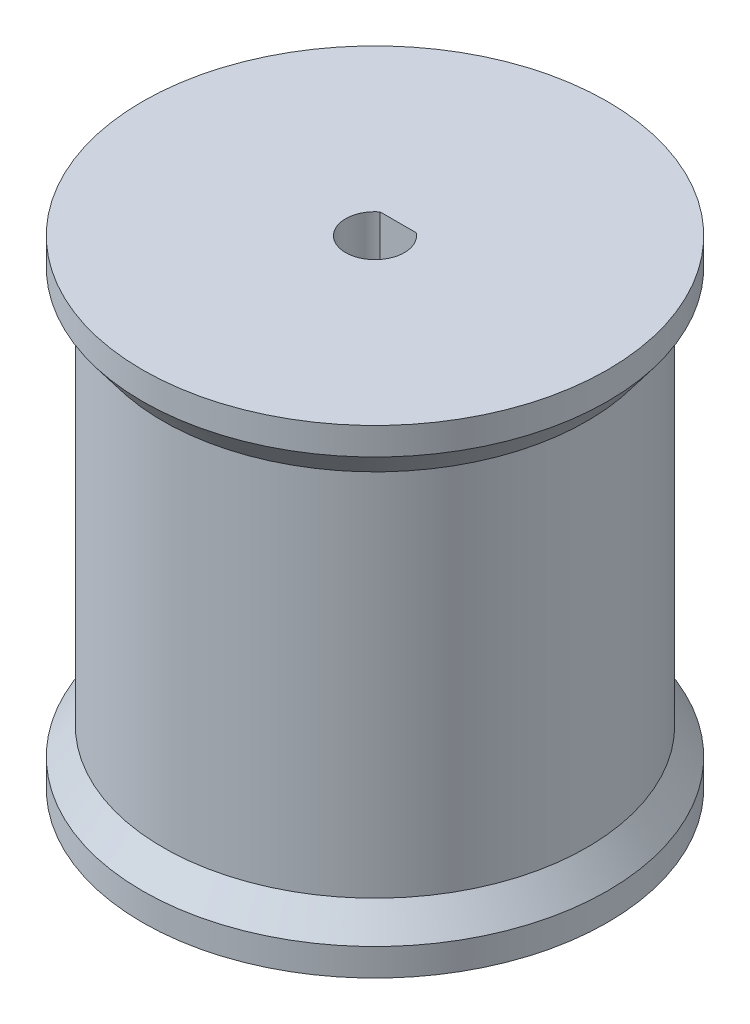
ISO-10303-21;
HEADER;
FILE_DESCRIPTION(('STEP AP214'),'2;1');
FILE_NAME('part.step','',(''),(''),'','','');
FILE_SCHEMA(('AUTOMOTIVE_DESIGN { 1 0 10303 214 1 1 1 1 }'));
ENDSEC;
DATA;
#1=APPLICATION_CONTEXT('core data for automotive mechanical design processes');
#2=APPLICATION_PROTOCOL_DEFINITION('international standard','automotive_design',2000,#1);
#3=PRODUCT_CONTEXT('',#1,'mechanical');
#4=PRODUCT('Part','Part','',(#3));
#5=PRODUCT_RELATED_PRODUCT_CATEGORY('part','',(#4));
#6=PRODUCT_DEFINITION_FORMATION('','',#4);
#7=PRODUCT_DEFINITION_CONTEXT('part definition',#1,'design');
#8=PRODUCT_DEFINITION('design','',#6,#7);
#9=PRODUCT_DEFINITION_SHAPE('','',#8);
#10=(LENGTH_UNIT() NAMED_UNIT(*) SI_UNIT(.MILLI.,.METRE.));
#11=(NAMED_UNIT(*) PLANE_ANGLE_UNIT() SI_UNIT($,.RADIAN.));
#12=(NAMED_UNIT(*) SI_UNIT($,.STERADIAN.) SOLID_ANGLE_UNIT());
#13=UNCERTAINTY_MEASURE_WITH_UNIT(LENGTH_MEASURE(1.E-05),#10,'distance_accuracy_value','');
#14=(GEOMETRIC_REPRESENTATION_CONTEXT(3) GLOBAL_UNCERTAINTY_ASSIGNED_CONTEXT((#13)) GLOBAL_UNIT_ASSIGNED_CONTEXT((#10,
#11,#12)) REPRESENTATION_CONTEXT('',''));
#15=CARTESIAN_POINT('',(0.,0.,0.));
#16=DIRECTION('',(0.,0.,1.));
#17=DIRECTION('',(1.,0.,0.));
#18=AXIS2_PLACEMENT_3D('',#15,#16,#17);
#19=CARTESIAN_POINT('',(-17.,0.,0.));
#20=DIRECTION('',(0.,1.,0.));
#21=DIRECTION('',(0.,0.,1.));
#22=AXIS2_PLACEMENT_3D('',#19,#20,#21);
#23=PLANE('',#22);
#24=CARTESIAN_POINT('',(0.,0.,0.));
#25=DIRECTION('',(0.,-1.,0.));
#26=DIRECTION('',(0.,0.,-1.));
#27=AXIS2_PLACEMENT_3D('',#24,#25,#26);
#28=CIRCLE('',#27,17.);
#29=CARTESIAN_POINT('',(0.,0.,-17.));
#30=VERTEX_POINT('',#29);
#31=EDGE_CURVE('E71',#30,#30,#28,.T.);
#32=ORIENTED_EDGE('',*,*,#31,.T.);
#33=EDGE_LOOP('',(#32));
#34=FACE_BOUND('',#33,.T.);
#35=ADVANCED_FACE('F39',(#34),#23,.F.);
#36=CARTESIAN_POINT('',(0.,35.,0.));
#37=DIRECTION('',(0.,-1.,0.));
#38=DIRECTION('',(0.,0.,-1.));
#39=AXIS2_PLACEMENT_3D('',#36,#37,#38);
#40=PLANE('',#39);
#41=DIRECTION('',(-1.,0.,0.));
#42=VECTOR('',#41,1.);
#43=CARTESIAN_POINT('',(-1.325,35.,-1.6931848688197));
#44=LINE('',#43,#42);
#45=CARTESIAN_POINT('',(1.325,35.,-1.6931848688197));
#46=VERTEX_POINT('',#45);
#47=CARTESIAN_POINT('',(-1.325,35.,-1.6931848688197));
#48=VERTEX_POINT('',#47);
#49=EDGE_CURVE('E75',#46,#48,#44,.T.);
#50=ORIENTED_EDGE('',*,*,#49,.F.);
#51=CARTESIAN_POINT('',(0.,35.,0.));
#52=DIRECTION('',(0.,1.,0.));
#53=DIRECTION('',(0.,0.,1.));
#54=AXIS2_PLACEMENT_3D('',#51,#52,#53);
#55=CIRCLE('',#54,2.15);
#56=EDGE_CURVE('E54',#48,#46,#55,.T.);
#57=ORIENTED_EDGE('',*,*,#56,.F.);
#58=EDGE_LOOP('',(#50,#57));
#59=FACE_BOUND('',#58,.T.);
#60=CARTESIAN_POINT('',(0.,35.,0.));
#61=DIRECTION('',(0.,-1.,0.));
#62=DIRECTION('',(0.,0.,-1.));
#63=AXIS2_PLACEMENT_3D('',#60,#61,#62);
#64=CIRCLE('',#63,17.);
#65=CARTESIAN_POINT('',(0.,35.,-17.));
#66=VERTEX_POINT('',#65);
#67=EDGE_CURVE('E11',#66,#66,#64,.T.);
#68=ORIENTED_EDGE('',*,*,#67,.F.);
#69=EDGE_LOOP('',(#68));
#70=FACE_BOUND('',#69,.T.);
#71=ADVANCED_FACE('F80',(#59,#70),#40,.F.);
#72=CARTESIAN_POINT('',(0.,0.,0.));
#73=DIRECTION('',(0.,-1.,0.));
#74=DIRECTION('',(0.,0.,-1.));
#75=AXIS2_PLACEMENT_3D('',#72,#73,#74);
#76=CYLINDRICAL_SURFACE('',#75,17.);
#77=CARTESIAN_POINT('',(0.,33.,0.));
#78=DIRECTION('',(0.,-1.,0.));
#79=DIRECTION('',(0.,0.,-1.));
#80=AXIS2_PLACEMENT_3D('',#77,#78,#79);
#81=CIRCLE('',#80,17.);
#82=CARTESIAN_POINT('',(0.,33.,-17.));
#83=VERTEX_POINT('',#82);
#84=EDGE_CURVE('E47',#83,#83,#81,.T.);
#85=ORIENTED_EDGE('',*,*,#84,.F.);
#86=EDGE_LOOP('',(#85));
#87=FACE_BOUND('',#86,.T.);
#88=ORIENTED_EDGE('',*,*,#67,.T.);
#89=EDGE_LOOP('',(#88));
#90=FACE_BOUND('',#89,.T.);
#91=ADVANCED_FACE('F110',(#87,#90),#76,.T.);
#92=CARTESIAN_POINT('',(0.,33.,0.));
#93=DIRECTION('',(0.,1.,0.));
#94=DIRECTION('',(0.,0.,1.));
#95=AXIS2_PLACEMENT_3D('',#92,#93,#94);
#96=CONICAL_SURFACE('',#95,17.,0.643501108793284);
#97=CARTESIAN_POINT('',(0.,31.,0.));
#98=DIRECTION('',(0.,-1.,0.));
#99=DIRECTION('',(0.,0.,-1.));
#100=AXIS2_PLACEMENT_3D('',#97,#98,#99);
#101=CIRCLE('',#100,15.5);
#102=CARTESIAN_POINT('',(0.,31.,-15.5));
#103=VERTEX_POINT('',#102);
#104=EDGE_CURVE('E101',#103,#103,#101,.T.);
#105=ORIENTED_EDGE('',*,*,#104,.F.);
#106=EDGE_LOOP('',(#105));
#107=FACE_BOUND('',#106,.T.);
#108=ORIENTED_EDGE('',*,*,#84,.T.);
#109=EDGE_LOOP('',(#108));
#110=FACE_BOUND('',#109,.T.);
#111=ADVANCED_FACE('F108',(#107,#110),#96,.T.);
#112=CARTESIAN_POINT('',(0.,0.,0.));
#113=DIRECTION('',(0.,-1.,0.));
#114=DIRECTION('',(0.,0.,-1.));
#115=AXIS2_PLACEMENT_3D('',#112,#113,#114);
#116=CYLINDRICAL_SURFACE('',#115,15.5);
#117=CARTESIAN_POINT('',(0.,4.,0.));
#118=DIRECTION('',(0.,-1.,0.));
#119=DIRECTION('',(0.,0.,-1.));
#120=AXIS2_PLACEMENT_3D('',#117,#118,#119);
#121=CIRCLE('',#120,15.5);
#122=CARTESIAN_POINT('',(0.,4.,-15.5));
#123=VERTEX_POINT('',#122);
#124=EDGE_CURVE('E97',#123,#123,#121,.T.);
#125=ORIENTED_EDGE('',*,*,#124,.F.);
#126=EDGE_LOOP('',(#125));
#127=FACE_BOUND('',#126,.T.);
#128=ORIENTED_EDGE('',*,*,#104,.T.);
#129=EDGE_LOOP('',(#128));
#130=FACE_BOUND('',#129,.T.);
#131=ADVANCED_FACE('F123',(#127,#130),#116,.T.);
#132=CARTESIAN_POINT('',(0.,4.,0.));
#133=DIRECTION('',(0.,-1.,0.));
#134=DIRECTION('',(0.,0.,-1.));
#135=AXIS2_PLACEMENT_3D('',#132,#133,#134);
#136=CONICAL_SURFACE('',#135,15.5,0.643501108793283);
#137=CARTESIAN_POINT('',(0.,2.,0.));
#138=DIRECTION('',(0.,-1.,0.));
#139=DIRECTION('',(0.,0.,-1.));
#140=AXIS2_PLACEMENT_3D('',#137,#138,#139);
#141=CIRCLE('',#140,17.);
#142=CARTESIAN_POINT('',(0.,2.,-17.));
#143=VERTEX_POINT('',#142);
#144=EDGE_CURVE('E93',#143,#143,#141,.T.);
#145=ORIENTED_EDGE('',*,*,#144,.F.);
#146=EDGE_LOOP('',(#145));
#147=FACE_BOUND('',#146,.T.);
#148=ORIENTED_EDGE('',*,*,#124,.T.);
#149=EDGE_LOOP('',(#148));
#150=FACE_BOUND('',#149,.T.);
#151=ADVANCED_FACE('F127',(#147,#150),#136,.T.);
#152=CARTESIAN_POINT('',(0.,0.,0.));
#153=DIRECTION('',(0.,-1.,0.));
#154=DIRECTION('',(0.,0.,-1.));
#155=AXIS2_PLACEMENT_3D('',#152,#153,#154);
#156=CYLINDRICAL_SURFACE('',#155,17.);
#157=ORIENTED_EDGE('',*,*,#31,.F.);
#158=EDGE_LOOP('',(#157));
#159=FACE_BOUND('',#158,.T.);
#160=ORIENTED_EDGE('',*,*,#144,.T.);
#161=EDGE_LOOP('',(#160));
#162=FACE_BOUND('',#161,.T.);
#163=ADVANCED_FACE('F131',(#159,#162),#156,.T.);
#164=CARTESIAN_POINT('',(0.,26.8,0.));
#165=DIRECTION('',(0.,1.,0.));
#166=DIRECTION('',(0.,0.,1.));
#167=AXIS2_PLACEMENT_3D('',#164,#165,#166);
#168=CYLINDRICAL_SURFACE('',#167,2.15);
#169=ORIENTED_EDGE('',*,*,#56,.T.);
#170=DIRECTION('',(0.,1.,0.));
#171=VECTOR('',#170,1.);
#172=CARTESIAN_POINT('',(1.325,26.8,-1.6931848688197));
#173=LINE('',#172,#171);
#174=CARTESIAN_POINT('',(1.325,26.8,-1.6931848688197));
#175=VERTEX_POINT('',#174);
#176=EDGE_CURVE('E72',#175,#46,#173,.T.);
#177=ORIENTED_EDGE('',*,*,#176,.F.);
#178=CARTESIAN_POINT('',(0.,26.8,0.));
#179=DIRECTION('',(0.,1.,0.));
#180=DIRECTION('',(0.,0.,1.));
#181=AXIS2_PLACEMENT_3D('',#178,#179,#180);
#182=CIRCLE('',#181,2.15);
#183=CARTESIAN_POINT('',(-1.325,26.8,-1.6931848688197));
#184=VERTEX_POINT('',#183);
#185=EDGE_CURVE('E68',#184,#175,#182,.T.);
#186=ORIENTED_EDGE('',*,*,#185,.F.);
#187=DIRECTION('',(0.,1.,0.));
#188=VECTOR('',#187,1.);
#189=CARTESIAN_POINT('',(-1.325,26.8,-1.6931848688197));
#190=LINE('',#189,#188);
#191=EDGE_CURVE('E62',#184,#48,#190,.T.);
#192=ORIENTED_EDGE('',*,*,#191,.T.);
#193=EDGE_LOOP('',(#169,#177,#186,#192));
#194=FACE_BOUND('',#193,.T.);
#195=ADVANCED_FACE('F66',(#194),#168,.F.);
#196=CARTESIAN_POINT('',(-1.325,26.8,-1.6931848688197));
#197=DIRECTION('',(0.,0.,-1.));
#198=DIRECTION('',(-1.,0.,0.));
#199=AXIS2_PLACEMENT_3D('',#196,#197,#198);
#200=PLANE('',#199);
#201=ORIENTED_EDGE('',*,*,#49,.T.);
#202=ORIENTED_EDGE('',*,*,#191,.F.);
#203=DIRECTION('',(-1.,0.,0.));
#204=VECTOR('',#203,1.);
#205=CARTESIAN_POINT('',(-1.325,26.8,-1.6931848688197));
#206=LINE('',#205,#204);
#207=EDGE_CURVE('E85',#175,#184,#206,.T.);
#208=ORIENTED_EDGE('',*,*,#207,.F.);
#209=ORIENTED_EDGE('',*,*,#176,.T.);
#210=EDGE_LOOP('',(#201,#202,#208,#209));
#211=FACE_BOUND('',#210,.T.);
#212=ADVANCED_FACE('F76',(#211),#200,.F.);
#213=CARTESIAN_POINT('',(0.,26.8,0.));
#214=DIRECTION('',(0.,1.,0.));
#215=DIRECTION('',(0.,0.,1.));
#216=AXIS2_PLACEMENT_3D('',#213,#214,#215);
#217=PLANE('',#216);
#218=ORIENTED_EDGE('',*,*,#185,.T.);
#219=ORIENTED_EDGE('',*,*,#207,.T.);
#220=EDGE_LOOP('',(#218,#219));
#221=FACE_BOUND('',#220,.T.);
#222=ADVANCED_FACE('F140',(#221),#217,.T.);
#223=CLOSED_SHELL('',(#35,#71,#91,#111,#131,#151,#163,#195,#212,#222));
#224=MANIFOLD_SOLID_BREP('B2',#223);
#225=ADVANCED_BREP_SHAPE_REPRESENTATION('',(#18,#224),#14);
#226=SHAPE_DEFINITION_REPRESENTATION(#9,#225);
ENDSEC;
END-ISO-10303-21;
